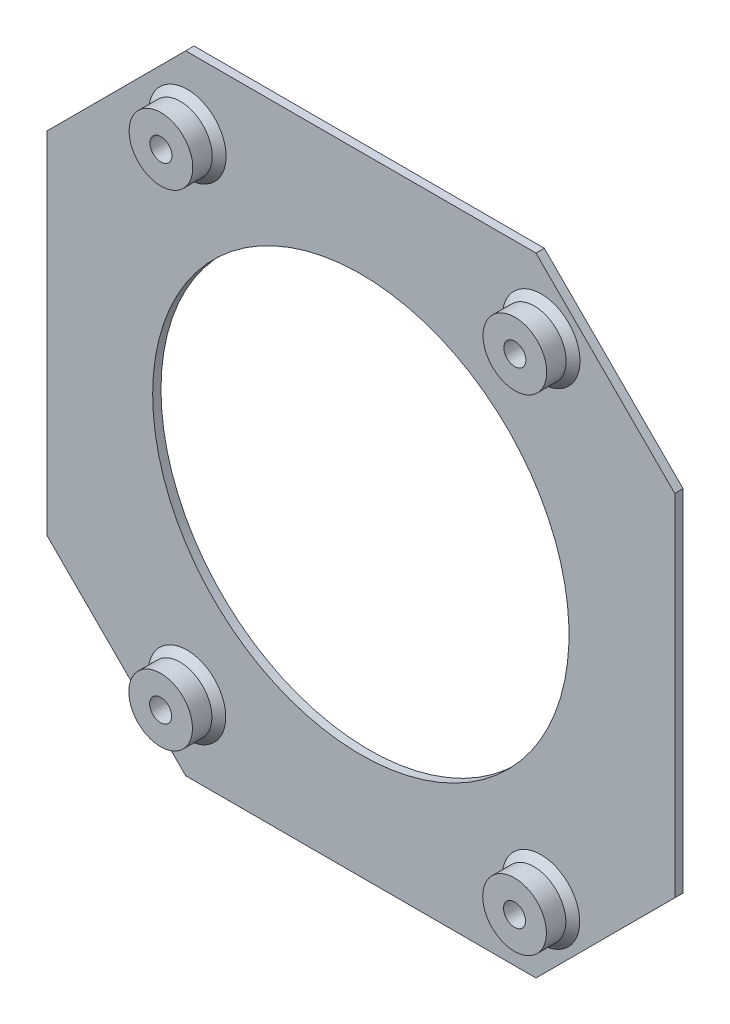
ISO-10303-21;
HEADER;
FILE_DESCRIPTION(('STEP AP214'),'2;1');
FILE_NAME('part.step','',(''),(''),'','','');
FILE_SCHEMA(('AUTOMOTIVE_DESIGN { 1 0 10303 214 1 1 1 1 }'));
ENDSEC;
DATA;
#1=APPLICATION_CONTEXT('core data for automotive mechanical design processes');
#2=APPLICATION_PROTOCOL_DEFINITION('international standard','automotive_design',2000,#1);
#3=PRODUCT_CONTEXT('',#1,'mechanical');
#4=PRODUCT('Part','Part','',(#3));
#5=PRODUCT_RELATED_PRODUCT_CATEGORY('part','',(#4));
#6=PRODUCT_DEFINITION_FORMATION('','',#4);
#7=PRODUCT_DEFINITION_CONTEXT('part definition',#1,'design');
#8=PRODUCT_DEFINITION('design','',#6,#7);
#9=PRODUCT_DEFINITION_SHAPE('','',#8);
#10=(LENGTH_UNIT() NAMED_UNIT(*) SI_UNIT(.MILLI.,.METRE.));
#11=(NAMED_UNIT(*) PLANE_ANGLE_UNIT() SI_UNIT($,.RADIAN.));
#12=(NAMED_UNIT(*) SI_UNIT($,.STERADIAN.) SOLID_ANGLE_UNIT());
#13=UNCERTAINTY_MEASURE_WITH_UNIT(LENGTH_MEASURE(1.E-05),#10,'distance_accuracy_value','');
#14=(GEOMETRIC_REPRESENTATION_CONTEXT(3) GLOBAL_UNCERTAINTY_ASSIGNED_CONTEXT((#13)) GLOBAL_UNIT_ASSIGNED_CONTEXT((#10,
#11,#12)) REPRESENTATION_CONTEXT('',''));
#15=CARTESIAN_POINT('',(0.,0.,0.));
#16=DIRECTION('',(0.,0.,1.));
#17=DIRECTION('',(1.,0.,0.));
#18=AXIS2_PLACEMENT_3D('',#15,#16,#17);
#19=CARTESIAN_POINT('',(45.2375,95.2375,0.));
#20=DIRECTION('',(-1.,0.,0.));
#21=DIRECTION('',(0.,0.,1.));
#22=AXIS2_PLACEMENT_3D('',#19,#20,#21);
#23=PLANE('',#22);
#24=DIRECTION('',(0.,-1.,0.));
#25=VECTOR('',#24,1.);
#26=CARTESIAN_POINT('',(45.2375,95.2375,1.2));
#27=LINE('',#26,#25);
#28=CARTESIAN_POINT('',(45.2375,75.2374999999999,1.2));
#29=VERTEX_POINT('',#28);
#30=CARTESIAN_POINT('',(45.2375,24.7625,1.2));
#31=VERTEX_POINT('',#30);
#32=EDGE_CURVE('E181',#29,#31,#27,.T.);
#33=ORIENTED_EDGE('',*,*,#32,.T.);
#34=DIRECTION('',(0.,0.,-1.));
#35=VECTOR('',#34,1.);
#36=CARTESIAN_POINT('',(45.2375,24.7625,0.));
#37=LINE('',#36,#35);
#38=CARTESIAN_POINT('',(45.2375,24.7625,0.));
#39=VERTEX_POINT('',#38);
#40=EDGE_CURVE('E137',#31,#39,#37,.T.);
#41=ORIENTED_EDGE('',*,*,#40,.T.);
#42=DIRECTION('',(0.,-1.,0.));
#43=VECTOR('',#42,1.);
#44=CARTESIAN_POINT('',(45.2375,95.2375,0.));
#45=LINE('',#44,#43);
#46=CARTESIAN_POINT('',(45.2375,75.2374999999999,0.));
#47=VERTEX_POINT('',#46);
#48=EDGE_CURVE('E129',#47,#39,#45,.T.);
#49=ORIENTED_EDGE('',*,*,#48,.F.);
#50=DIRECTION('',(0.,0.,1.));
#51=VECTOR('',#50,1.);
#52=CARTESIAN_POINT('',(45.2375,75.2374999999999,0.));
#53=LINE('',#52,#51);
#54=EDGE_CURVE('E142',#47,#29,#53,.T.);
#55=ORIENTED_EDGE('',*,*,#54,.T.);
#56=EDGE_LOOP('',(#33,#41,#49,#55));
#57=FACE_BOUND('',#56,.T.);
#58=ADVANCED_FACE('F59',(#57),#23,.F.);
#59=CARTESIAN_POINT('',(45.2375,95.2375,0.));
#60=DIRECTION('',(0.,0.,1.));
#61=DIRECTION('',(1.,0.,0.));
#62=AXIS2_PLACEMENT_3D('',#59,#60,#61);
#63=PLANE('',#62);
#64=CARTESIAN_POINT('',(0.,50.,0.));
#65=DIRECTION('',(0.,0.,-1.));
#66=DIRECTION('',(-1.,0.,0.));
#67=AXIS2_PLACEMENT_3D('',#64,#65,#66);
#68=CIRCLE('',#67,30.);
#69=CARTESIAN_POINT('',(-30.,50.,0.));
#70=VERTEX_POINT('',#69);
#71=EDGE_CURVE('E597',#70,#70,#68,.T.);
#72=ORIENTED_EDGE('',*,*,#71,.F.);
#73=EDGE_LOOP('',(#72));
#74=FACE_BOUND('',#73,.T.);
#75=ORIENTED_EDGE('',*,*,#48,.T.);
#76=DIRECTION('',(-0.707106781186549,-0.707106781186546,0.));
#77=VECTOR('',#76,1.);
#78=CARTESIAN_POINT('',(45.2375,24.7625,0.));
#79=LINE('',#78,#77);
#80=CARTESIAN_POINT('',(25.2374999999999,4.7625,0.));
#81=VERTEX_POINT('',#80);
#82=EDGE_CURVE('E162',#39,#81,#79,.T.);
#83=ORIENTED_EDGE('',*,*,#82,.T.);
#84=DIRECTION('',(-1.,0.,0.));
#85=VECTOR('',#84,1.);
#86=CARTESIAN_POINT('',(45.2375,4.7625,0.));
#87=LINE('',#86,#85);
#88=CARTESIAN_POINT('',(-25.2374999999999,4.7625,0.));
#89=VERTEX_POINT('',#88);
#90=EDGE_CURVE('E189',#81,#89,#87,.T.);
#91=ORIENTED_EDGE('',*,*,#90,.T.);
#92=DIRECTION('',(-0.707106781186549,0.707106781186546,0.));
#93=VECTOR('',#92,1.);
#94=CARTESIAN_POINT('',(-45.2375,24.7625,0.));
#95=LINE('',#94,#93);
#96=CARTESIAN_POINT('',(-45.2375,24.7625,0.));
#97=VERTEX_POINT('',#96);
#98=EDGE_CURVE('E160',#89,#97,#95,.T.);
#99=ORIENTED_EDGE('',*,*,#98,.T.);
#100=DIRECTION('',(0.,-1.,0.));
#101=VECTOR('',#100,1.);
#102=CARTESIAN_POINT('',(-45.2375,95.2375,0.));
#103=LINE('',#102,#101);
#104=CARTESIAN_POINT('',(-45.2375,75.2374999999999,0.));
#105=VERTEX_POINT('',#104);
#106=EDGE_CURVE('E146',#105,#97,#103,.T.);
#107=ORIENTED_EDGE('',*,*,#106,.F.);
#108=DIRECTION('',(-0.707106781186546,-0.707106781186549,0.));
#109=VECTOR('',#108,1.);
#110=CARTESIAN_POINT('',(-25.2375,95.2375,0.));
#111=LINE('',#110,#109);
#112=CARTESIAN_POINT('',(-25.2375,95.2375,0.));
#113=VERTEX_POINT('',#112);
#114=EDGE_CURVE('E136',#105,#113,#111,.F.);
#115=ORIENTED_EDGE('',*,*,#114,.T.);
#116=DIRECTION('',(-1.,0.,0.));
#117=VECTOR('',#116,1.);
#118=CARTESIAN_POINT('',(45.2375,95.2375,0.));
#119=LINE('',#118,#117);
#120=CARTESIAN_POINT('',(25.2375,95.2375,0.));
#121=VERTEX_POINT('',#120);
#122=EDGE_CURVE('E131',#121,#113,#119,.T.);
#123=ORIENTED_EDGE('',*,*,#122,.F.);
#124=DIRECTION('',(-0.707106781186546,0.707106781186549,0.));
#125=VECTOR('',#124,1.);
#126=CARTESIAN_POINT('',(25.2375,95.2375,0.));
#127=LINE('',#126,#125);
#128=EDGE_CURVE('E126',#121,#47,#127,.F.);
#129=ORIENTED_EDGE('',*,*,#128,.T.);
#130=EDGE_LOOP('',(#75,#83,#91,#99,#107,#115,#123,#129));
#131=FACE_BOUND('',#130,.T.);
#132=ADVANCED_FACE('F128',(#74,#131),#63,.F.);
#133=CARTESIAN_POINT('',(-45.2375,95.2375,0.));
#134=DIRECTION('',(1.,0.,0.));
#135=DIRECTION('',(0.,0.,-1.));
#136=AXIS2_PLACEMENT_3D('',#133,#134,#135);
#137=PLANE('',#136);
#138=ORIENTED_EDGE('',*,*,#106,.T.);
#139=DIRECTION('',(0.,0.,1.));
#140=VECTOR('',#139,1.);
#141=CARTESIAN_POINT('',(-45.2375,24.7625,1.20000000000001));
#142=LINE('',#141,#140);
#143=CARTESIAN_POINT('',(-45.2375,24.7625,1.20000000000001));
#144=VERTEX_POINT('',#143);
#145=EDGE_CURVE('E175',#97,#144,#142,.T.);
#146=ORIENTED_EDGE('',*,*,#145,.T.);
#147=DIRECTION('',(0.,-1.,0.));
#148=VECTOR('',#147,1.);
#149=CARTESIAN_POINT('',(-45.2375,95.2375,1.20000000000001));
#150=LINE('',#149,#148);
#151=CARTESIAN_POINT('',(-45.2375,75.2374999999999,1.20000000000001));
#152=VERTEX_POINT('',#151);
#153=EDGE_CURVE('E183',#152,#144,#150,.T.);
#154=ORIENTED_EDGE('',*,*,#153,.F.);
#155=DIRECTION('',(0.,0.,-1.));
#156=VECTOR('',#155,1.);
#157=CARTESIAN_POINT('',(-45.2375,75.2374999999999,0.));
#158=LINE('',#157,#156);
#159=EDGE_CURVE('E173',#152,#105,#158,.T.);
#160=ORIENTED_EDGE('',*,*,#159,.T.);
#161=EDGE_LOOP('',(#138,#146,#154,#160));
#162=FACE_BOUND('',#161,.T.);
#163=ADVANCED_FACE('F243',(#162),#137,.F.);
#164=CARTESIAN_POINT('',(45.2375,95.2375,1.2));
#165=DIRECTION('',(0.,0.,-1.));
#166=DIRECTION('',(-1.,0.,0.));
#167=AXIS2_PLACEMENT_3D('',#164,#165,#166);
#168=PLANE('',#167);
#169=CARTESIAN_POINT('',(0.,50.,1.20000000000001));
#170=DIRECTION('',(0.,0.,-1.));
#171=DIRECTION('',(-1.,0.,0.));
#172=AXIS2_PLACEMENT_3D('',#169,#170,#171);
#173=CIRCLE('',#172,30.);
#174=CARTESIAN_POINT('',(-30.,50.,1.20000000000001));
#175=VERTEX_POINT('',#174);
#176=EDGE_CURVE('E157',#175,#175,#173,.T.);
#177=ORIENTED_EDGE('',*,*,#176,.T.);
#178=EDGE_LOOP('',(#177));
#179=FACE_BOUND('',#178,.T.);
#180=CARTESIAN_POINT('',(25.9504029637398,14.9271371576919,1.2));
#181=DIRECTION('',(0.,0.,-1.));
#182=DIRECTION('',(-1.,0.,0.));
#183=AXIS2_PLACEMENT_3D('',#180,#181,#182);
#184=CIRCLE('',#183,5.58749682499995);
#185=CARTESIAN_POINT('',(20.3629061387399,14.9271371576919,1.2));
#186=VERTEX_POINT('',#185);
#187=EDGE_CURVE('E209',#186,#186,#184,.T.);
#188=ORIENTED_EDGE('',*,*,#187,.T.);
#189=EDGE_LOOP('',(#188));
#190=FACE_BOUND('',#189,.T.);
#191=CARTESIAN_POINT('',(-25.0494842175008,14.9603562957205,1.20000000000001));
#192=DIRECTION('',(0.,0.,-1.));
#193=DIRECTION('',(-1.,0.,0.));
#194=AXIS2_PLACEMENT_3D('',#191,#192,#193);
#195=CIRCLE('',#194,5.58749682500004);
#196=CARTESIAN_POINT('',(-30.6369810425008,14.9603562957205,1.20000000000001));
#197=VERTEX_POINT('',#196);
#198=EDGE_CURVE('E206',#197,#197,#195,.T.);
#199=ORIENTED_EDGE('',*,*,#198,.T.);
#200=EDGE_LOOP('',(#199));
#201=FACE_BOUND('',#200,.T.);
#202=CARTESIAN_POINT('',(-25.0038893221675,84.9602014464428,1.20000000000001));
#203=DIRECTION('',(0.,0.,-1.));
#204=DIRECTION('',(-1.,0.,0.));
#205=AXIS2_PLACEMENT_3D('',#202,#203,#204);
#206=CIRCLE('',#205,5.58749682500001);
#207=CARTESIAN_POINT('',(-30.5913861471676,84.9602014464428,1.20000000000001));
#208=VERTEX_POINT('',#207);
#209=EDGE_CURVE('E203',#208,#208,#206,.T.);
#210=ORIENTED_EDGE('',*,*,#209,.T.);
#211=EDGE_LOOP('',(#210));
#212=FACE_BOUND('',#211,.T.);
#213=CARTESIAN_POINT('',(25.9959978590731,84.9269823084142,1.2));
#214=DIRECTION('',(0.,0.,-1.));
#215=DIRECTION('',(-1.,0.,0.));
#216=AXIS2_PLACEMENT_3D('',#213,#214,#215);
#217=CIRCLE('',#216,5.58749682499995);
#218=CARTESIAN_POINT('',(20.4085010340731,84.9269823084142,1.2));
#219=VERTEX_POINT('',#218);
#220=EDGE_CURVE('E200',#219,#219,#217,.T.);
#221=ORIENTED_EDGE('',*,*,#220,.T.);
#222=EDGE_LOOP('',(#221));
#223=FACE_BOUND('',#222,.T.);
#224=DIRECTION('',(1.,0.,0.));
#225=VECTOR('',#224,1.);
#226=CARTESIAN_POINT('',(45.2375,4.7625,1.2));
#227=LINE('',#226,#225);
#228=CARTESIAN_POINT('',(-25.2374999999999,4.7625,1.20000000000001));
#229=VERTEX_POINT('',#228);
#230=CARTESIAN_POINT('',(25.2374999999999,4.7625,1.2));
#231=VERTEX_POINT('',#230);
#232=EDGE_CURVE('E185',#229,#231,#227,.T.);
#233=ORIENTED_EDGE('',*,*,#232,.T.);
#234=DIRECTION('',(0.707106781186549,0.707106781186546,0.));
#235=VECTOR('',#234,1.);
#236=CARTESIAN_POINT('',(45.2375,24.7625,1.2));
#237=LINE('',#236,#235);
#238=EDGE_CURVE('E171',#231,#31,#237,.T.);
#239=ORIENTED_EDGE('',*,*,#238,.T.);
#240=ORIENTED_EDGE('',*,*,#32,.F.);
#241=DIRECTION('',(0.707106781186546,-0.707106781186549,0.));
#242=VECTOR('',#241,1.);
#243=CARTESIAN_POINT('',(25.2375,95.2375,1.2));
#244=LINE('',#243,#242);
#245=CARTESIAN_POINT('',(25.2375,95.2375,1.2));
#246=VERTEX_POINT('',#245);
#247=EDGE_CURVE('E149',#29,#246,#244,.F.);
#248=ORIENTED_EDGE('',*,*,#247,.T.);
#249=DIRECTION('',(1.,0.,0.));
#250=VECTOR('',#249,1.);
#251=CARTESIAN_POINT('',(45.2375,95.2375,1.2));
#252=LINE('',#251,#250);
#253=CARTESIAN_POINT('',(-25.2375,95.2375,1.20000000000001));
#254=VERTEX_POINT('',#253);
#255=EDGE_CURVE('E180',#254,#246,#252,.T.);
#256=ORIENTED_EDGE('',*,*,#255,.F.);
#257=DIRECTION('',(0.707106781186546,0.707106781186549,0.));
#258=VECTOR('',#257,1.);
#259=CARTESIAN_POINT('',(-25.2375,95.2375,1.20000000000001));
#260=LINE('',#259,#258);
#261=EDGE_CURVE('E82',#254,#152,#260,.F.);
#262=ORIENTED_EDGE('',*,*,#261,.T.);
#263=ORIENTED_EDGE('',*,*,#153,.T.);
#264=DIRECTION('',(0.707106781186549,-0.707106781186546,0.));
#265=VECTOR('',#264,1.);
#266=CARTESIAN_POINT('',(-45.2375,24.7625,1.20000000000001));
#267=LINE('',#266,#265);
#268=EDGE_CURVE('E74',#144,#229,#267,.T.);
#269=ORIENTED_EDGE('',*,*,#268,.T.);
#270=EDGE_LOOP('',(#233,#239,#240,#248,#256,#262,#263,#269));
#271=FACE_BOUND('',#270,.T.);
#272=ADVANCED_FACE('F258',(#179,#190,#201,#212,#223,#271),#168,.F.);
#273=CARTESIAN_POINT('',(0.,95.2375,0.));
#274=DIRECTION('',(0.,-1.,0.));
#275=DIRECTION('',(0.,0.,-1.));
#276=AXIS2_PLACEMENT_3D('',#273,#274,#275);
#277=PLANE('',#276);
#278=ORIENTED_EDGE('',*,*,#122,.T.);
#279=DIRECTION('',(0.,0.,1.));
#280=VECTOR('',#279,1.);
#281=CARTESIAN_POINT('',(-25.2375,95.2375,0.));
#282=LINE('',#281,#280);
#283=EDGE_CURVE('E12',#113,#254,#282,.T.);
#284=ORIENTED_EDGE('',*,*,#283,.T.);
#285=ORIENTED_EDGE('',*,*,#255,.T.);
#286=DIRECTION('',(0.,0.,-1.));
#287=VECTOR('',#286,1.);
#288=CARTESIAN_POINT('',(25.2375,95.2375,0.));
#289=LINE('',#288,#287);
#290=EDGE_CURVE('E67',#246,#121,#289,.T.);
#291=ORIENTED_EDGE('',*,*,#290,.T.);
#292=EDGE_LOOP('',(#278,#284,#285,#291));
#293=FACE_BOUND('',#292,.T.);
#294=ADVANCED_FACE('F178',(#293),#277,.F.);
#295=CARTESIAN_POINT('',(0.,4.7625,0.));
#296=DIRECTION('',(0.,-1.,0.));
#297=DIRECTION('',(0.,0.,-1.));
#298=AXIS2_PLACEMENT_3D('',#295,#296,#297);
#299=PLANE('',#298);
#300=ORIENTED_EDGE('',*,*,#90,.F.);
#301=DIRECTION('',(0.,0.,1.));
#302=VECTOR('',#301,1.);
#303=CARTESIAN_POINT('',(25.2374999999999,4.7625,1.2));
#304=LINE('',#303,#302);
#305=EDGE_CURVE('E166',#81,#231,#304,.T.);
#306=ORIENTED_EDGE('',*,*,#305,.T.);
#307=ORIENTED_EDGE('',*,*,#232,.F.);
#308=DIRECTION('',(0.,0.,-1.));
#309=VECTOR('',#308,1.);
#310=CARTESIAN_POINT('',(-25.2374999999999,4.7625,0.));
#311=LINE('',#310,#309);
#312=EDGE_CURVE('E164',#229,#89,#311,.T.);
#313=ORIENTED_EDGE('',*,*,#312,.T.);
#314=EDGE_LOOP('',(#300,#306,#307,#313));
#315=FACE_BOUND('',#314,.T.);
#316=ADVANCED_FACE('F366',(#315),#299,.T.);
#317=CARTESIAN_POINT('',(-25.0038893221675,84.9602014464428,-11.7754004545171));
#318=DIRECTION('',(0.,0.,1.));
#319=DIRECTION('',(1.,0.,0.));
#320=AXIS2_PLACEMENT_3D('',#317,#318,#319);
#321=CYLINDRICAL_SURFACE('',#320,4.58749682500001);
#322=CARTESIAN_POINT('',(-25.0038893221675,84.9602014464428,2.20000000000003));
#323=DIRECTION('',(0.,0.,-1.));
#324=DIRECTION('',(-1.,0.,0.));
#325=AXIS2_PLACEMENT_3D('',#322,#323,#324);
#326=CIRCLE('',#325,4.58749682500001);
#327=CARTESIAN_POINT('',(-29.5913861471676,84.9602014464428,2.20000000000003));
#328=VERTEX_POINT('',#327);
#329=EDGE_CURVE('E154',#328,#328,#326,.F.);
#330=ORIENTED_EDGE('',*,*,#329,.T.);
#331=EDGE_LOOP('',(#330));
#332=FACE_BOUND('',#331,.T.);
#333=CARTESIAN_POINT('',(-25.0038893221675,84.9602014464428,5.));
#334=DIRECTION('',(0.,0.,-1.));
#335=DIRECTION('',(-1.,0.,0.));
#336=AXIS2_PLACEMENT_3D('',#333,#334,#335);
#337=CIRCLE('',#336,4.58749682500001);
#338=CARTESIAN_POINT('',(-29.5913861471676,84.9602014464428,5.));
#339=VERTEX_POINT('',#338);
#340=EDGE_CURVE('E192',#339,#339,#337,.T.);
#341=ORIENTED_EDGE('',*,*,#340,.T.);
#342=EDGE_LOOP('',(#341));
#343=FACE_BOUND('',#342,.T.);
#344=ADVANCED_FACE('F218',(#332,#343),#321,.T.);
#345=CARTESIAN_POINT('',(-25.0038893221675,84.9602014464428,5.));
#346=DIRECTION('',(0.,0.,-1.));
#347=DIRECTION('',(-1.,0.,0.));
#348=AXIS2_PLACEMENT_3D('',#345,#346,#347);
#349=PLANE('',#348);
#350=ORIENTED_EDGE('',*,*,#340,.F.);
#351=EDGE_LOOP('',(#350));
#352=FACE_BOUND('',#351,.T.);
#353=CARTESIAN_POINT('',(-25.0038893221675,84.9602014464428,5.));
#354=DIRECTION('',(0.,0.,-1.));
#355=DIRECTION('',(-1.,0.,0.));
#356=AXIS2_PLACEMENT_3D('',#353,#354,#355);
#357=CIRCLE('',#356,1.58749682500001);
#358=CARTESIAN_POINT('',(-26.5913861471676,84.9602014464428,5.));
#359=VERTEX_POINT('',#358);
#360=EDGE_CURVE('E300',#359,#359,#357,.T.);
#361=ORIENTED_EDGE('',*,*,#360,.T.);
#362=EDGE_LOOP('',(#361));
#363=FACE_BOUND('',#362,.T.);
#364=ADVANCED_FACE('F320',(#352,#363),#349,.F.);
#365=CARTESIAN_POINT('',(-25.0038893221675,84.9602014464428,-11.7754004545171));
#366=DIRECTION('',(0.,0.,1.));
#367=DIRECTION('',(1.,0.,0.));
#368=AXIS2_PLACEMENT_3D('',#365,#366,#367);
#369=CYLINDRICAL_SURFACE('',#368,1.58749682500001);
#370=ORIENTED_EDGE('',*,*,#360,.F.);
#371=EDGE_LOOP('',(#370));
#372=FACE_BOUND('',#371,.T.);
#373=CARTESIAN_POINT('',(-25.0038893221675,84.9602014464428,1.20000000000001));
#374=DIRECTION('',(0.,0.,-1.));
#375=DIRECTION('',(-1.,0.,0.));
#376=AXIS2_PLACEMENT_3D('',#373,#374,#375);
#377=CIRCLE('',#376,1.58749682500001);
#378=CARTESIAN_POINT('',(-26.5913861471676,84.9602014464428,1.20000000000001));
#379=VERTEX_POINT('',#378);
#380=EDGE_CURVE('E297',#379,#379,#377,.T.);
#381=ORIENTED_EDGE('',*,*,#380,.T.);
#382=EDGE_LOOP('',(#381));
#383=FACE_BOUND('',#382,.T.);
#384=ADVANCED_FACE('F307',(#372,#383),#369,.F.);
#385=ORIENTED_EDGE('',*,*,#380,.F.);
#386=EDGE_LOOP('',(#385));
#387=FACE_BOUND('',#386,.T.);
#388=ADVANCED_FACE('F309',(#387),#168,.F.);
#389=CARTESIAN_POINT('',(25.9959978590731,84.9269823084142,-11.7754004545171));
#390=DIRECTION('',(0.,0.,1.));
#391=DIRECTION('',(1.,0.,0.));
#392=AXIS2_PLACEMENT_3D('',#389,#390,#391);
#393=CYLINDRICAL_SURFACE('',#392,4.58749682499998);
#394=CARTESIAN_POINT('',(25.9959978590731,84.9269823084142,2.19999999999998));
#395=DIRECTION('',(0.,0.,-1.));
#396=DIRECTION('',(-1.,0.,0.));
#397=AXIS2_PLACEMENT_3D('',#394,#395,#396);
#398=CIRCLE('',#397,4.58749682499998);
#399=CARTESIAN_POINT('',(21.4085010340731,84.9269823084142,2.19999999999998));
#400=VERTEX_POINT('',#399);
#401=EDGE_CURVE('E150',#400,#400,#398,.F.);
#402=ORIENTED_EDGE('',*,*,#401,.T.);
#403=EDGE_LOOP('',(#402));
#404=FACE_BOUND('',#403,.T.);
#405=CARTESIAN_POINT('',(25.9959978590731,84.9269823084142,5.));
#406=DIRECTION('',(0.,0.,-1.));
#407=DIRECTION('',(-1.,0.,0.));
#408=AXIS2_PLACEMENT_3D('',#405,#406,#407);
#409=CIRCLE('',#408,4.58749682499998);
#410=CARTESIAN_POINT('',(21.4085010340731,84.9269823084142,5.));
#411=VERTEX_POINT('',#410);
#412=EDGE_CURVE('E294',#411,#411,#409,.T.);
#413=ORIENTED_EDGE('',*,*,#412,.T.);
#414=EDGE_LOOP('',(#413));
#415=FACE_BOUND('',#414,.T.);
#416=ADVANCED_FACE('F311',(#404,#415),#393,.T.);
#417=CARTESIAN_POINT('',(25.9959978590731,84.9269823084142,5.));
#418=DIRECTION('',(0.,0.,-1.));
#419=DIRECTION('',(-1.,0.,0.));
#420=AXIS2_PLACEMENT_3D('',#417,#418,#419);
#421=PLANE('',#420);
#422=ORIENTED_EDGE('',*,*,#412,.F.);
#423=EDGE_LOOP('',(#422));
#424=FACE_BOUND('',#423,.T.);
#425=CARTESIAN_POINT('',(25.9959978590731,84.9269823084142,5.));
#426=DIRECTION('',(0.,0.,-1.));
#427=DIRECTION('',(-1.,0.,0.));
#428=AXIS2_PLACEMENT_3D('',#425,#426,#427);
#429=CIRCLE('',#428,1.58749682499998);
#430=CARTESIAN_POINT('',(24.4085010340731,84.9269823084142,5.));
#431=VERTEX_POINT('',#430);
#432=EDGE_CURVE('E291',#431,#431,#429,.T.);
#433=ORIENTED_EDGE('',*,*,#432,.T.);
#434=EDGE_LOOP('',(#433));
#435=FACE_BOUND('',#434,.T.);
#436=ADVANCED_FACE('F317',(#424,#435),#421,.F.);
#437=CARTESIAN_POINT('',(25.9959978590731,84.9269823084142,-11.7754004545171));
#438=DIRECTION('',(0.,0.,1.));
#439=DIRECTION('',(1.,0.,0.));
#440=AXIS2_PLACEMENT_3D('',#437,#438,#439);
#441=CYLINDRICAL_SURFACE('',#440,1.58749682499998);
#442=ORIENTED_EDGE('',*,*,#432,.F.);
#443=EDGE_LOOP('',(#442));
#444=FACE_BOUND('',#443,.T.);
#445=CARTESIAN_POINT('',(25.9959978590731,84.9269823084142,1.2));
#446=DIRECTION('',(0.,0.,-1.));
#447=DIRECTION('',(-1.,0.,0.));
#448=AXIS2_PLACEMENT_3D('',#445,#446,#447);
#449=CIRCLE('',#448,1.58749682499998);
#450=CARTESIAN_POINT('',(24.4085010340731,84.9269823084142,1.2));
#451=VERTEX_POINT('',#450);
#452=EDGE_CURVE('E289',#451,#451,#449,.T.);
#453=ORIENTED_EDGE('',*,*,#452,.T.);
#454=EDGE_LOOP('',(#453));
#455=FACE_BOUND('',#454,.T.);
#456=ADVANCED_FACE('F328',(#444,#455),#441,.F.);
#457=ORIENTED_EDGE('',*,*,#452,.F.);
#458=EDGE_LOOP('',(#457));
#459=FACE_BOUND('',#458,.T.);
#460=ADVANCED_FACE('F312',(#459),#168,.F.);
#461=CARTESIAN_POINT('',(-25.0494842175008,14.9603562957205,-11.7754004545171));
#462=DIRECTION('',(0.,0.,1.));
#463=DIRECTION('',(1.,0.,0.));
#464=AXIS2_PLACEMENT_3D('',#461,#462,#463);
#465=CYLINDRICAL_SURFACE('',#464,4.58749682500001);
#466=CARTESIAN_POINT('',(-25.0494842175008,14.9603562957205,2.20000000000004));
#467=DIRECTION('',(0.,0.,-1.));
#468=DIRECTION('',(-1.,0.,0.));
#469=AXIS2_PLACEMENT_3D('',#466,#467,#468);
#470=CIRCLE('',#469,4.58749682500001);
#471=CARTESIAN_POINT('',(-29.6369810425008,14.9603562957205,2.20000000000004));
#472=VERTEX_POINT('',#471);
#473=EDGE_CURVE('E212',#472,#472,#470,.F.);
#474=ORIENTED_EDGE('',*,*,#473,.T.);
#475=EDGE_LOOP('',(#474));
#476=FACE_BOUND('',#475,.T.);
#477=CARTESIAN_POINT('',(-25.0494842175008,14.9603562957205,5.));
#478=DIRECTION('',(0.,0.,-1.));
#479=DIRECTION('',(-1.,0.,0.));
#480=AXIS2_PLACEMENT_3D('',#477,#478,#479);
#481=CIRCLE('',#480,4.58749682500001);
#482=CARTESIAN_POINT('',(-29.6369810425008,14.9603562957205,5.));
#483=VERTEX_POINT('',#482);
#484=EDGE_CURVE('E287',#483,#483,#481,.T.);
#485=ORIENTED_EDGE('',*,*,#484,.T.);
#486=EDGE_LOOP('',(#485));
#487=FACE_BOUND('',#486,.T.);
#488=ADVANCED_FACE('F327',(#476,#487),#465,.T.);
#489=CARTESIAN_POINT('',(-25.0494842175008,14.9603562957205,5.));
#490=DIRECTION('',(0.,0.,-1.));
#491=DIRECTION('',(-1.,0.,0.));
#492=AXIS2_PLACEMENT_3D('',#489,#490,#491);
#493=PLANE('',#492);
#494=ORIENTED_EDGE('',*,*,#484,.F.);
#495=EDGE_LOOP('',(#494));
#496=FACE_BOUND('',#495,.T.);
#497=CARTESIAN_POINT('',(-25.0494842175008,14.9603562957205,5.));
#498=DIRECTION('',(0.,0.,-1.));
#499=DIRECTION('',(-1.,0.,0.));
#500=AXIS2_PLACEMENT_3D('',#497,#498,#499);
#501=CIRCLE('',#500,1.58749682500001);
#502=CARTESIAN_POINT('',(-26.6369810425008,14.9603562957205,5.));
#503=VERTEX_POINT('',#502);
#504=EDGE_CURVE('E276',#503,#503,#501,.T.);
#505=ORIENTED_EDGE('',*,*,#504,.T.);
#506=EDGE_LOOP('',(#505));
#507=FACE_BOUND('',#506,.T.);
#508=ADVANCED_FACE('F334',(#496,#507),#493,.F.);
#509=CARTESIAN_POINT('',(-25.0494842175008,14.9603562957205,-11.7754004545171));
#510=DIRECTION('',(0.,0.,1.));
#511=DIRECTION('',(1.,0.,0.));
#512=AXIS2_PLACEMENT_3D('',#509,#510,#511);
#513=CYLINDRICAL_SURFACE('',#512,1.58749682500001);
#514=ORIENTED_EDGE('',*,*,#504,.F.);
#515=EDGE_LOOP('',(#514));
#516=FACE_BOUND('',#515,.T.);
#517=CARTESIAN_POINT('',(-25.0494842175008,14.9603562957205,1.20000000000001));
#518=DIRECTION('',(0.,0.,-1.));
#519=DIRECTION('',(-1.,0.,0.));
#520=AXIS2_PLACEMENT_3D('',#517,#518,#519);
#521=CIRCLE('',#520,1.58749682500001);
#522=CARTESIAN_POINT('',(-26.6369810425008,14.9603562957205,1.20000000000001));
#523=VERTEX_POINT('',#522);
#524=EDGE_CURVE('E272',#523,#523,#521,.T.);
#525=ORIENTED_EDGE('',*,*,#524,.T.);
#526=EDGE_LOOP('',(#525));
#527=FACE_BOUND('',#526,.T.);
#528=ADVANCED_FACE('F341',(#516,#527),#513,.F.);
#529=ORIENTED_EDGE('',*,*,#524,.F.);
#530=EDGE_LOOP('',(#529));
#531=FACE_BOUND('',#530,.T.);
#532=ADVANCED_FACE('F257',(#531),#168,.F.);
#533=CARTESIAN_POINT('',(25.9504029637398,14.9271371576919,-11.7754004545171));
#534=DIRECTION('',(0.,0.,1.));
#535=DIRECTION('',(1.,0.,0.));
#536=AXIS2_PLACEMENT_3D('',#533,#534,#535);
#537=CYLINDRICAL_SURFACE('',#536,4.58749682499998);
#538=CARTESIAN_POINT('',(25.9504029637398,14.9271371576919,2.19999999999998));
#539=DIRECTION('',(0.,0.,-1.));
#540=DIRECTION('',(-1.,0.,0.));
#541=AXIS2_PLACEMENT_3D('',#538,#539,#540);
#542=CIRCLE('',#541,4.58749682499998);
#543=CARTESIAN_POINT('',(21.3629061387398,14.9271371576919,2.19999999999998));
#544=VERTEX_POINT('',#543);
#545=EDGE_CURVE('E145',#544,#544,#542,.F.);
#546=ORIENTED_EDGE('',*,*,#545,.T.);
#547=EDGE_LOOP('',(#546));
#548=FACE_BOUND('',#547,.T.);
#549=CARTESIAN_POINT('',(25.9504029637398,14.9271371576919,5.));
#550=DIRECTION('',(0.,0.,-1.));
#551=DIRECTION('',(-1.,0.,0.));
#552=AXIS2_PLACEMENT_3D('',#549,#550,#551);
#553=CIRCLE('',#552,4.58749682499998);
#554=CARTESIAN_POINT('',(21.3629061387398,14.9271371576919,5.));
#555=VERTEX_POINT('',#554);
#556=EDGE_CURVE('E270',#555,#555,#553,.T.);
#557=ORIENTED_EDGE('',*,*,#556,.T.);
#558=EDGE_LOOP('',(#557));
#559=FACE_BOUND('',#558,.T.);
#560=ADVANCED_FACE('F263',(#548,#559),#537,.T.);
#561=CARTESIAN_POINT('',(25.9504029637398,14.9271371576919,5.));
#562=DIRECTION('',(0.,0.,-1.));
#563=DIRECTION('',(-1.,0.,0.));
#564=AXIS2_PLACEMENT_3D('',#561,#562,#563);
#565=PLANE('',#564);
#566=ORIENTED_EDGE('',*,*,#556,.F.);
#567=EDGE_LOOP('',(#566));
#568=FACE_BOUND('',#567,.T.);
#569=CARTESIAN_POINT('',(25.9504029637398,14.9271371576919,5.));
#570=DIRECTION('',(0.,0.,-1.));
#571=DIRECTION('',(-1.,0.,0.));
#572=AXIS2_PLACEMENT_3D('',#569,#570,#571);
#573=CIRCLE('',#572,1.58749682499998);
#574=CARTESIAN_POINT('',(24.3629061387398,14.9271371576919,5.));
#575=VERTEX_POINT('',#574);
#576=EDGE_CURVE('E273',#575,#575,#573,.T.);
#577=ORIENTED_EDGE('',*,*,#576,.T.);
#578=EDGE_LOOP('',(#577));
#579=FACE_BOUND('',#578,.T.);
#580=ADVANCED_FACE('F266',(#568,#579),#565,.F.);
#581=CARTESIAN_POINT('',(25.9504029637398,14.9271371576919,-11.7754004545171));
#582=DIRECTION('',(0.,0.,1.));
#583=DIRECTION('',(1.,0.,0.));
#584=AXIS2_PLACEMENT_3D('',#581,#582,#583);
#585=CYLINDRICAL_SURFACE('',#584,1.58749682499998);
#586=ORIENTED_EDGE('',*,*,#576,.F.);
#587=EDGE_LOOP('',(#586));
#588=FACE_BOUND('',#587,.T.);
#589=CARTESIAN_POINT('',(25.9504029637398,14.9271371576919,1.2));
#590=DIRECTION('',(0.,0.,-1.));
#591=DIRECTION('',(-1.,0.,0.));
#592=AXIS2_PLACEMENT_3D('',#589,#590,#591);
#593=CIRCLE('',#592,1.58749682499998);
#594=CARTESIAN_POINT('',(24.3629061387398,14.9271371576919,1.2));
#595=VERTEX_POINT('',#594);
#596=EDGE_CURVE('E279',#595,#595,#593,.T.);
#597=ORIENTED_EDGE('',*,*,#596,.T.);
#598=EDGE_LOOP('',(#597));
#599=FACE_BOUND('',#598,.T.);
#600=ADVANCED_FACE('F254',(#588,#599),#585,.F.);
#601=ORIENTED_EDGE('',*,*,#596,.F.);
#602=EDGE_LOOP('',(#601));
#603=FACE_BOUND('',#602,.T.);
#604=ADVANCED_FACE('F249',(#603),#168,.F.);
#605=CARTESIAN_POINT('',(25.9504029637398,14.9271371576919,2.19999999999998));
#606=DIRECTION('',(0.,0.,-1.));
#607=DIRECTION('',(-1.,0.,0.));
#608=AXIS2_PLACEMENT_3D('',#605,#606,#607);
#609=CONICAL_SURFACE('',#608,4.58749682499998,0.785398163397444);
#610=ORIENTED_EDGE('',*,*,#187,.F.);
#611=EDGE_LOOP('',(#610));
#612=FACE_BOUND('',#611,.T.);
#613=ORIENTED_EDGE('',*,*,#545,.F.);
#614=EDGE_LOOP('',(#613));
#615=FACE_BOUND('',#614,.T.);
#616=ADVANCED_FACE('F234',(#612,#615),#609,.T.);
#617=CARTESIAN_POINT('',(-25.0494842175008,14.9603562957205,2.20000000000004));
#618=DIRECTION('',(0.,0.,-1.));
#619=DIRECTION('',(-1.,0.,0.));
#620=AXIS2_PLACEMENT_3D('',#617,#618,#619);
#621=CONICAL_SURFACE('',#620,4.58749682500001,0.785398163397444);
#622=ORIENTED_EDGE('',*,*,#198,.F.);
#623=EDGE_LOOP('',(#622));
#624=FACE_BOUND('',#623,.T.);
#625=ORIENTED_EDGE('',*,*,#473,.F.);
#626=EDGE_LOOP('',(#625));
#627=FACE_BOUND('',#626,.T.);
#628=ADVANCED_FACE('F224',(#624,#627),#621,.T.);
#629=CARTESIAN_POINT('',(-25.0038893221675,84.9602014464428,2.20000000000003));
#630=DIRECTION('',(0.,0.,-1.));
#631=DIRECTION('',(-1.,0.,0.));
#632=AXIS2_PLACEMENT_3D('',#629,#630,#631);
#633=CONICAL_SURFACE('',#632,4.58749682500001,0.785398163397437);
#634=ORIENTED_EDGE('',*,*,#209,.F.);
#635=EDGE_LOOP('',(#634));
#636=FACE_BOUND('',#635,.T.);
#637=ORIENTED_EDGE('',*,*,#329,.F.);
#638=EDGE_LOOP('',(#637));
#639=FACE_BOUND('',#638,.T.);
#640=ADVANCED_FACE('F221',(#636,#639),#633,.T.);
#641=CARTESIAN_POINT('',(25.9959978590731,84.9269823084142,2.19999999999998));
#642=DIRECTION('',(0.,0.,-1.));
#643=DIRECTION('',(-1.,0.,0.));
#644=AXIS2_PLACEMENT_3D('',#641,#642,#643);
#645=CONICAL_SURFACE('',#644,4.58749682499998,0.785398163397444);
#646=ORIENTED_EDGE('',*,*,#220,.F.);
#647=EDGE_LOOP('',(#646));
#648=FACE_BOUND('',#647,.T.);
#649=ORIENTED_EDGE('',*,*,#401,.F.);
#650=EDGE_LOOP('',(#649));
#651=FACE_BOUND('',#650,.T.);
#652=ADVANCED_FACE('F223',(#648,#651),#645,.T.);
#653=CARTESIAN_POINT('',(0.,50.,5.00000000000001));
#654=DIRECTION('',(0.,0.,-1.));
#655=DIRECTION('',(-1.,0.,0.));
#656=AXIS2_PLACEMENT_3D('',#653,#654,#655);
#657=CYLINDRICAL_SURFACE('',#656,30.);
#658=ORIENTED_EDGE('',*,*,#71,.T.);
#659=EDGE_LOOP('',(#658));
#660=FACE_BOUND('',#659,.T.);
#661=ORIENTED_EDGE('',*,*,#176,.F.);
#662=EDGE_LOOP('',(#661));
#663=FACE_BOUND('',#662,.T.);
#664=ADVANCED_FACE('F231',(#660,#663),#657,.F.);
#665=CARTESIAN_POINT('',(45.2375,24.7625,0.));
#666=DIRECTION('',(0.707106781186546,-0.707106781186549,0.));
#667=DIRECTION('',(0.,0.,1.));
#668=AXIS2_PLACEMENT_3D('',#665,#666,#667);
#669=PLANE('',#668);
#670=ORIENTED_EDGE('',*,*,#238,.F.);
#671=ORIENTED_EDGE('',*,*,#305,.F.);
#672=ORIENTED_EDGE('',*,*,#82,.F.);
#673=ORIENTED_EDGE('',*,*,#40,.F.);
#674=EDGE_LOOP('',(#670,#671,#672,#673));
#675=FACE_BOUND('',#674,.T.);
#676=ADVANCED_FACE('F378',(#675),#669,.T.);
#677=CARTESIAN_POINT('',(-45.2375,24.7625,0.));
#678=DIRECTION('',(-0.707106781186546,-0.707106781186549,0.));
#679=DIRECTION('',(0.,0.,-1.));
#680=AXIS2_PLACEMENT_3D('',#677,#678,#679);
#681=PLANE('',#680);
#682=ORIENTED_EDGE('',*,*,#98,.F.);
#683=ORIENTED_EDGE('',*,*,#312,.F.);
#684=ORIENTED_EDGE('',*,*,#268,.F.);
#685=ORIENTED_EDGE('',*,*,#145,.F.);
#686=EDGE_LOOP('',(#682,#683,#684,#685));
#687=FACE_BOUND('',#686,.T.);
#688=ADVANCED_FACE('F379',(#687),#681,.T.);
#689=CARTESIAN_POINT('',(-25.2375,95.2375,0.));
#690=DIRECTION('',(0.707106781186549,-0.707106781186546,0.));
#691=DIRECTION('',(0.,0.,1.));
#692=AXIS2_PLACEMENT_3D('',#689,#690,#691);
#693=PLANE('',#692);
#694=ORIENTED_EDGE('',*,*,#114,.F.);
#695=ORIENTED_EDGE('',*,*,#159,.F.);
#696=ORIENTED_EDGE('',*,*,#261,.F.);
#697=ORIENTED_EDGE('',*,*,#283,.F.);
#698=EDGE_LOOP('',(#694,#695,#696,#697));
#699=FACE_BOUND('',#698,.T.);
#700=ADVANCED_FACE('F385',(#699),#693,.F.);
#701=CARTESIAN_POINT('',(25.2375,95.2375,0.));
#702=DIRECTION('',(-0.707106781186549,-0.707106781186546,0.));
#703=DIRECTION('',(0.,0.,-1.));
#704=AXIS2_PLACEMENT_3D('',#701,#702,#703);
#705=PLANE('',#704);
#706=ORIENTED_EDGE('',*,*,#247,.F.);
#707=ORIENTED_EDGE('',*,*,#54,.F.);
#708=ORIENTED_EDGE('',*,*,#128,.F.);
#709=ORIENTED_EDGE('',*,*,#290,.F.);
#710=EDGE_LOOP('',(#706,#707,#708,#709));
#711=FACE_BOUND('',#710,.T.);
#712=ADVANCED_FACE('F61',(#711),#705,.F.);
#713=CLOSED_SHELL('',(#58,#132,#163,#272,#294,#316,#344,#364,#384,#388,#416,#436,#456,#460,#488,
#508,#528,#532,#560,#580,#600,#604,#616,#628,#640,#652,#664,#676,#688,#700,#712));
#714=MANIFOLD_SOLID_BREP('B2',#713);
#715=ADVANCED_BREP_SHAPE_REPRESENTATION('',(#18,#714),#14);
#716=SHAPE_DEFINITION_REPRESENTATION(#9,#715);
ENDSEC;
END-ISO-10303-21;
